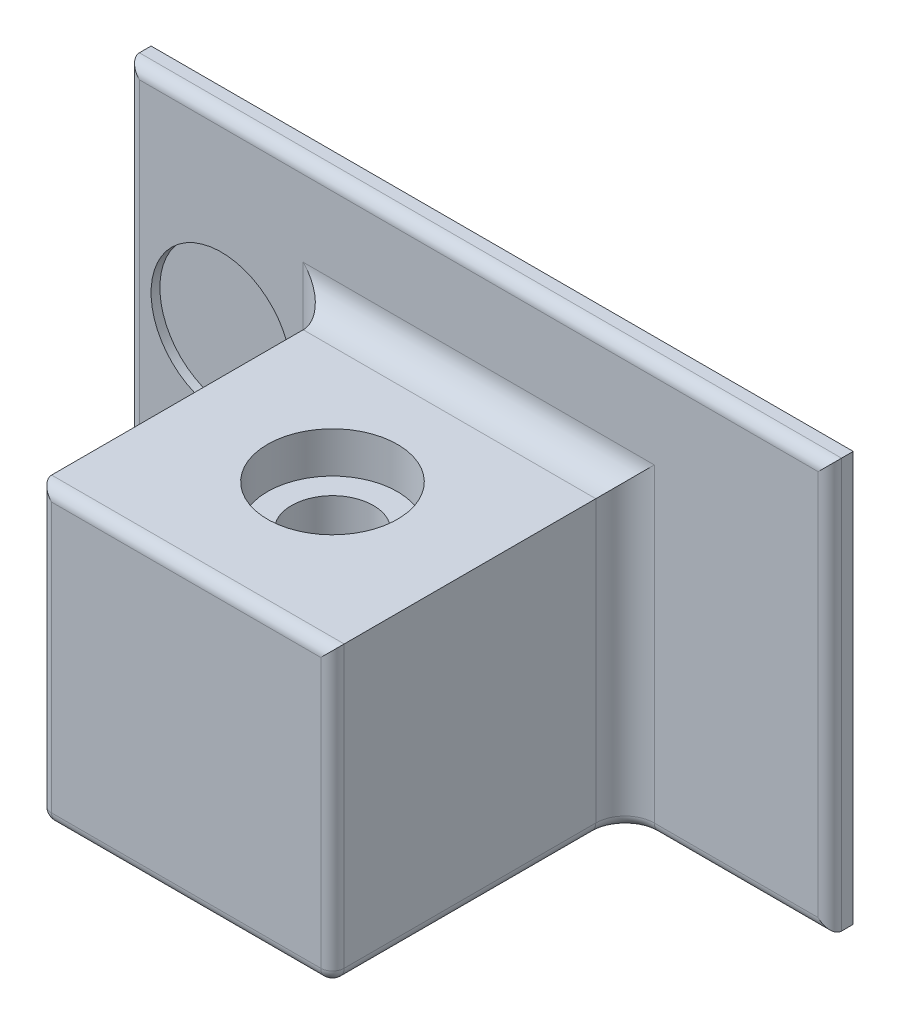
ISO-10303-21;
HEADER;
FILE_DESCRIPTION(('STEP AP214'),'2;1');
FILE_NAME('part.step','',(''),(''),'','','');
FILE_SCHEMA(('AUTOMOTIVE_DESIGN { 1 0 10303 214 1 1 1 1 }'));
ENDSEC;
DATA;
#1=APPLICATION_CONTEXT('core data for automotive mechanical design processes');
#2=APPLICATION_PROTOCOL_DEFINITION('international standard','automotive_design',2000,#1);
#3=PRODUCT_CONTEXT('',#1,'mechanical');
#4=PRODUCT('Part','Part','',(#3));
#5=PRODUCT_RELATED_PRODUCT_CATEGORY('part','',(#4));
#6=PRODUCT_DEFINITION_FORMATION('','',#4);
#7=PRODUCT_DEFINITION_CONTEXT('part definition',#1,'design');
#8=PRODUCT_DEFINITION('design','',#6,#7);
#9=PRODUCT_DEFINITION_SHAPE('','',#8);
#10=(LENGTH_UNIT() NAMED_UNIT(*) SI_UNIT(.MILLI.,.METRE.));
#11=(NAMED_UNIT(*) PLANE_ANGLE_UNIT() SI_UNIT($,.RADIAN.));
#12=(NAMED_UNIT(*) SI_UNIT($,.STERADIAN.) SOLID_ANGLE_UNIT());
#13=UNCERTAINTY_MEASURE_WITH_UNIT(LENGTH_MEASURE(1.E-05),#10,'distance_accuracy_value','');
#14=(GEOMETRIC_REPRESENTATION_CONTEXT(3) GLOBAL_UNCERTAINTY_ASSIGNED_CONTEXT((#13)) GLOBAL_UNIT_ASSIGNED_CONTEXT((#10,
#11,#12)) REPRESENTATION_CONTEXT('',''));
#15=CARTESIAN_POINT('',(0.,0.,0.));
#16=DIRECTION('',(0.,0.,1.));
#17=DIRECTION('',(1.,0.,0.));
#18=AXIS2_PLACEMENT_3D('',#15,#16,#17);
#19=CARTESIAN_POINT('',(0.,35.,29.));
#20=DIRECTION('',(0.,-1.,0.));
#21=DIRECTION('',(1.,0.,0.));
#22=AXIS2_PLACEMENT_3D('',#19,#20,#21);
#23=CYLINDRICAL_SURFACE('',#22,7.);
#24=CARTESIAN_POINT('',(0.,-28.,29.));
#25=DIRECTION('',(0.,-1.,0.));
#26=DIRECTION('',(1.,0.,0.));
#27=AXIS2_PLACEMENT_3D('',#24,#25,#26);
#28=CIRCLE('',#27,7.);
#29=CARTESIAN_POINT('',(7.,-28.,29.));
#30=VERTEX_POINT('',#29);
#31=EDGE_CURVE('E204',#30,#30,#28,.T.);
#32=ORIENTED_EDGE('',*,*,#31,.T.);
#33=EDGE_LOOP('',(#32));
#34=FACE_BOUND('',#33,.T.);
#35=CARTESIAN_POINT('',(0.,8.,29.));
#36=DIRECTION('',(0.,1.,0.));
#37=DIRECTION('',(-1.,0.,0.));
#38=AXIS2_PLACEMENT_3D('',#35,#36,#37);
#39=CIRCLE('',#38,7.);
#40=CARTESIAN_POINT('',(-7.,8.,29.));
#41=VERTEX_POINT('',#40);
#42=EDGE_CURVE('E196',#41,#41,#39,.F.);
#43=ORIENTED_EDGE('',*,*,#42,.F.);
#44=EDGE_LOOP('',(#43));
#45=FACE_BOUND('',#44,.T.);
#46=ADVANCED_FACE('F41',(#34,#45),#23,.F.);
#47=CARTESIAN_POINT('',(-60.,35.,4.));
#48=DIRECTION('',(0.,-1.,0.));
#49=DIRECTION('',(1.,0.,0.));
#50=AXIS2_PLACEMENT_3D('',#47,#48,#49);
#51=PLANE('',#50);
#52=DIRECTION('',(0.,0.,-1.));
#53=VECTOR('',#52,1.);
#54=CARTESIAN_POINT('',(-60.,35.,4.));
#55=LINE('',#54,#53);
#56=CARTESIAN_POINT('',(-60.,35.,2.));
#57=VERTEX_POINT('',#56);
#58=CARTESIAN_POINT('',(-60.,35.,0.));
#59=VERTEX_POINT('',#58);
#60=EDGE_CURVE('E156',#57,#59,#55,.T.);
#61=ORIENTED_EDGE('',*,*,#60,.F.);
#62=DIRECTION('',(-1.,0.,0.));
#63=VECTOR('',#62,1.);
#64=CARTESIAN_POINT('',(60.,35.,2.));
#65=LINE('',#64,#63);
#66=CARTESIAN_POINT('',(60.,35.,2.));
#67=VERTEX_POINT('',#66);
#68=EDGE_CURVE('E264',#57,#67,#65,.F.);
#69=ORIENTED_EDGE('',*,*,#68,.T.);
#70=DIRECTION('',(0.,0.,-1.));
#71=VECTOR('',#70,1.);
#72=CARTESIAN_POINT('',(60.,35.,4.));
#73=LINE('',#72,#71);
#74=CARTESIAN_POINT('',(60.,35.,0.));
#75=VERTEX_POINT('',#74);
#76=EDGE_CURVE('E183',#67,#75,#73,.T.);
#77=ORIENTED_EDGE('',*,*,#76,.T.);
#78=DIRECTION('',(-1.,0.,0.));
#79=VECTOR('',#78,1.);
#80=CARTESIAN_POINT('',(-60.,35.,0.));
#81=LINE('',#80,#79);
#82=EDGE_CURVE('E178',#75,#59,#81,.T.);
#83=ORIENTED_EDGE('',*,*,#82,.T.);
#84=EDGE_LOOP('',(#61,#69,#77,#83));
#85=FACE_BOUND('',#84,.T.);
#86=ADVANCED_FACE('F185',(#85),#51,.F.);
#87=CARTESIAN_POINT('',(-60.,-35.,4.));
#88=DIRECTION('',(1.,0.,0.));
#89=DIRECTION('',(0.,0.,-1.));
#90=AXIS2_PLACEMENT_3D('',#87,#88,#89);
#91=PLANE('',#90);
#92=DIRECTION('',(0.,0.,-1.));
#93=VECTOR('',#92,1.);
#94=CARTESIAN_POINT('',(-60.,-35.,4.));
#95=LINE('',#94,#93);
#96=CARTESIAN_POINT('',(-60.,-35.,2.));
#97=VERTEX_POINT('',#96);
#98=CARTESIAN_POINT('',(-60.,-35.,0.));
#99=VERTEX_POINT('',#98);
#100=EDGE_CURVE('E175',#97,#99,#95,.T.);
#101=ORIENTED_EDGE('',*,*,#100,.F.);
#102=DIRECTION('',(0.,-1.,0.));
#103=VECTOR('',#102,1.);
#104=CARTESIAN_POINT('',(-60.,35.,2.));
#105=LINE('',#104,#103);
#106=EDGE_CURVE('E170',#97,#57,#105,.F.);
#107=ORIENTED_EDGE('',*,*,#106,.T.);
#108=ORIENTED_EDGE('',*,*,#60,.T.);
#109=DIRECTION('',(0.,-1.,0.));
#110=VECTOR('',#109,1.);
#111=CARTESIAN_POINT('',(-60.,-35.,0.));
#112=LINE('',#111,#110);
#113=EDGE_CURVE('E165',#59,#99,#112,.T.);
#114=ORIENTED_EDGE('',*,*,#113,.T.);
#115=EDGE_LOOP('',(#101,#107,#108,#114));
#116=FACE_BOUND('',#115,.T.);
#117=ADVANCED_FACE('F161',(#116),#91,.F.);
#118=CARTESIAN_POINT('',(-60.,-35.,4.));
#119=DIRECTION('',(0.,1.,0.));
#120=DIRECTION('',(-1.,0.,0.));
#121=AXIS2_PLACEMENT_3D('',#118,#119,#120);
#122=PLANE('',#121);
#123=DIRECTION('',(0.,0.,-1.));
#124=VECTOR('',#123,1.);
#125=CARTESIAN_POINT('',(60.,-35.,4.));
#126=LINE('',#125,#124);
#127=CARTESIAN_POINT('',(60.,-35.,2.));
#128=VERTEX_POINT('',#127);
#129=CARTESIAN_POINT('',(60.,-35.,0.));
#130=VERTEX_POINT('',#129);
#131=EDGE_CURVE('E197',#128,#130,#126,.T.);
#132=ORIENTED_EDGE('',*,*,#131,.F.);
#133=DIRECTION('',(1.,0.,0.));
#134=VECTOR('',#133,1.);
#135=CARTESIAN_POINT('',(30.,-35.,2.));
#136=LINE('',#135,#134);
#137=CARTESIAN_POINT('',(30.,-35.,2.));
#138=VERTEX_POINT('',#137);
#139=EDGE_CURVE('E242',#128,#138,#136,.F.);
#140=ORIENTED_EDGE('',*,*,#139,.T.);
#141=CARTESIAN_POINT('',(30.,-35.,9.));
#142=DIRECTION('',(0.,1.,0.));
#143=DIRECTION('',(-1.,0.,0.));
#144=AXIS2_PLACEMENT_3D('',#141,#142,#143);
#145=CIRCLE('',#144,7.);
#146=CARTESIAN_POINT('',(23.,-35.,9.));
#147=VERTEX_POINT('',#146);
#148=EDGE_CURVE('E245',#138,#147,#145,.T.);
#149=ORIENTED_EDGE('',*,*,#148,.T.);
#150=DIRECTION('',(0.,0.,-1.));
#151=VECTOR('',#150,1.);
#152=CARTESIAN_POINT('',(23.,-35.,4.));
#153=LINE('',#152,#151);
#154=CARTESIAN_POINT('',(23.,-35.,52.));
#155=VERTEX_POINT('',#154);
#156=EDGE_CURVE('E237',#147,#155,#153,.F.);
#157=ORIENTED_EDGE('',*,*,#156,.T.);
#158=DIRECTION('',(1.,0.,0.));
#159=VECTOR('',#158,1.);
#160=CARTESIAN_POINT('',(-25.,-35.,52.));
#161=LINE('',#160,#159);
#162=CARTESIAN_POINT('',(-23.,-35.,52.));
#163=VERTEX_POINT('',#162);
#164=EDGE_CURVE('E233',#155,#163,#161,.F.);
#165=ORIENTED_EDGE('',*,*,#164,.T.);
#166=DIRECTION('',(0.,0.,-1.));
#167=VECTOR('',#166,1.);
#168=CARTESIAN_POINT('',(-23.,-35.,4.));
#169=LINE('',#168,#167);
#170=CARTESIAN_POINT('',(-23.,-35.,9.));
#171=VERTEX_POINT('',#170);
#172=EDGE_CURVE('E231',#163,#171,#169,.T.);
#173=ORIENTED_EDGE('',*,*,#172,.T.);
#174=CARTESIAN_POINT('',(-30.,-35.,9.));
#175=DIRECTION('',(0.,1.,0.));
#176=DIRECTION('',(-1.,0.,0.));
#177=AXIS2_PLACEMENT_3D('',#174,#175,#176);
#178=CIRCLE('',#177,7.);
#179=CARTESIAN_POINT('',(-30.,-35.,2.));
#180=VERTEX_POINT('',#179);
#181=EDGE_CURVE('E232',#171,#180,#178,.T.);
#182=ORIENTED_EDGE('',*,*,#181,.T.);
#183=DIRECTION('',(1.,0.,0.));
#184=VECTOR('',#183,1.);
#185=CARTESIAN_POINT('',(-60.,-35.,2.));
#186=LINE('',#185,#184);
#187=EDGE_CURVE('E240',#180,#97,#186,.F.);
#188=ORIENTED_EDGE('',*,*,#187,.T.);
#189=ORIENTED_EDGE('',*,*,#100,.T.);
#190=DIRECTION('',(1.,0.,0.));
#191=VECTOR('',#190,1.);
#192=CARTESIAN_POINT('',(-60.,-35.,0.));
#193=LINE('',#192,#191);
#194=EDGE_CURVE('E179',#99,#130,#193,.T.);
#195=ORIENTED_EDGE('',*,*,#194,.T.);
#196=EDGE_LOOP('',(#132,#140,#149,#157,#165,#173,#182,#188,#189,#195));
#197=FACE_BOUND('',#196,.T.);
#198=CARTESIAN_POINT('',(0.,-35.,29.));
#199=DIRECTION('',(0.,-1.,0.));
#200=DIRECTION('',(1.,0.,0.));
#201=AXIS2_PLACEMENT_3D('',#198,#199,#200);
#202=CIRCLE('',#201,11.1);
#203=CARTESIAN_POINT('',(11.1,-35.,29.));
#204=VERTEX_POINT('',#203);
#205=EDGE_CURVE('E375',#204,#204,#202,.T.);
#206=ORIENTED_EDGE('',*,*,#205,.F.);
#207=EDGE_LOOP('',(#206));
#208=FACE_BOUND('',#207,.T.);
#209=ADVANCED_FACE('F326',(#197,#208),#122,.F.);
#210=CARTESIAN_POINT('',(60.,-35.,4.));
#211=DIRECTION('',(-1.,0.,0.));
#212=DIRECTION('',(0.,0.,1.));
#213=AXIS2_PLACEMENT_3D('',#210,#211,#212);
#214=PLANE('',#213);
#215=ORIENTED_EDGE('',*,*,#76,.F.);
#216=DIRECTION('',(0.,1.,0.));
#217=VECTOR('',#216,1.);
#218=CARTESIAN_POINT('',(60.,-35.,2.));
#219=LINE('',#218,#217);
#220=EDGE_CURVE('E258',#67,#128,#219,.F.);
#221=ORIENTED_EDGE('',*,*,#220,.T.);
#222=ORIENTED_EDGE('',*,*,#131,.T.);
#223=DIRECTION('',(0.,1.,0.));
#224=VECTOR('',#223,1.);
#225=CARTESIAN_POINT('',(60.,-35.,0.));
#226=LINE('',#225,#224);
#227=EDGE_CURVE('E194',#130,#75,#226,.T.);
#228=ORIENTED_EDGE('',*,*,#227,.T.);
#229=EDGE_LOOP('',(#215,#221,#222,#228));
#230=FACE_BOUND('',#229,.T.);
#231=ADVANCED_FACE('F402',(#230),#214,.F.);
#232=CARTESIAN_POINT('',(0.,0.,4.));
#233=DIRECTION('',(0.,0.,1.));
#234=DIRECTION('',(1.,0.,0.));
#235=AXIS2_PLACEMENT_3D('',#232,#233,#234);
#236=PLANE('',#235);
#237=DIRECTION('',(0.,1.,0.));
#238=VECTOR('',#237,1.);
#239=CARTESIAN_POINT('',(30.,0.,4.));
#240=LINE('',#239,#238);
#241=CARTESIAN_POINT('',(30.,20.,4.));
#242=VERTEX_POINT('',#241);
#243=CARTESIAN_POINT('',(30.,-33.,4.));
#244=VERTEX_POINT('',#243);
#245=EDGE_CURVE('E208',#242,#244,#240,.F.);
#246=ORIENTED_EDGE('',*,*,#245,.T.);
#247=DIRECTION('',(1.,0.,0.));
#248=VECTOR('',#247,1.);
#249=CARTESIAN_POINT('',(60.,-33.,4.));
#250=LINE('',#249,#248);
#251=CARTESIAN_POINT('',(58.,-33.,4.));
#252=VERTEX_POINT('',#251);
#253=EDGE_CURVE('E257',#244,#252,#250,.T.);
#254=ORIENTED_EDGE('',*,*,#253,.T.);
#255=DIRECTION('',(0.,1.,0.));
#256=VECTOR('',#255,1.);
#257=CARTESIAN_POINT('',(58.,35.,4.));
#258=LINE('',#257,#256);
#259=CARTESIAN_POINT('',(58.,33.,4.));
#260=VERTEX_POINT('',#259);
#261=EDGE_CURVE('E255',#252,#260,#258,.T.);
#262=ORIENTED_EDGE('',*,*,#261,.T.);
#263=DIRECTION('',(-1.,0.,0.));
#264=VECTOR('',#263,1.);
#265=CARTESIAN_POINT('',(-60.,33.,4.));
#266=LINE('',#265,#264);
#267=CARTESIAN_POINT('',(-58.,33.,4.));
#268=VERTEX_POINT('',#267);
#269=EDGE_CURVE('E249',#260,#268,#266,.T.);
#270=ORIENTED_EDGE('',*,*,#269,.T.);
#271=DIRECTION('',(0.,-1.,0.));
#272=VECTOR('',#271,1.);
#273=CARTESIAN_POINT('',(-58.,-35.,4.));
#274=LINE('',#273,#272);
#275=CARTESIAN_POINT('',(-58.,-33.,4.));
#276=VERTEX_POINT('',#275);
#277=EDGE_CURVE('E247',#268,#276,#274,.T.);
#278=ORIENTED_EDGE('',*,*,#277,.T.);
#279=DIRECTION('',(1.,0.,0.));
#280=VECTOR('',#279,1.);
#281=CARTESIAN_POINT('',(-30.,-33.,4.));
#282=LINE('',#281,#280);
#283=CARTESIAN_POINT('',(-30.,-33.,4.));
#284=VERTEX_POINT('',#283);
#285=EDGE_CURVE('E251',#276,#284,#282,.T.);
#286=ORIENTED_EDGE('',*,*,#285,.T.);
#287=DIRECTION('',(0.,-1.,0.));
#288=VECTOR('',#287,1.);
#289=CARTESIAN_POINT('',(-30.,0.,4.));
#290=LINE('',#289,#288);
#291=CARTESIAN_POINT('',(-30.,20.,4.));
#292=VERTEX_POINT('',#291);
#293=EDGE_CURVE('E207',#284,#292,#290,.F.);
#294=ORIENTED_EDGE('',*,*,#293,.T.);
#295=DIRECTION('',(-1.,0.,0.));
#296=VECTOR('',#295,1.);
#297=CARTESIAN_POINT('',(0.,20.,4.));
#298=LINE('',#297,#296);
#299=EDGE_CURVE('E206',#292,#242,#298,.F.);
#300=ORIENTED_EDGE('',*,*,#299,.T.);
#301=EDGE_LOOP('',(#246,#254,#262,#270,#278,#286,#294,#300));
#302=FACE_BOUND('',#301,.T.);
#303=CARTESIAN_POINT('',(-44.,2.5,4.));
#304=DIRECTION('',(0.,0.,1.));
#305=DIRECTION('',(1.,0.,0.));
#306=AXIS2_PLACEMENT_3D('',#303,#304,#305);
#307=CIRCLE('',#306,12.);
#308=CARTESIAN_POINT('',(-32.,2.5,4.));
#309=VERTEX_POINT('',#308);
#310=EDGE_CURVE('E228',#309,#309,#307,.T.);
#311=ORIENTED_EDGE('',*,*,#310,.F.);
#312=EDGE_LOOP('',(#311));
#313=FACE_BOUND('',#312,.T.);
#314=ADVANCED_FACE('F400',(#302,#313),#236,.T.);
#315=CARTESIAN_POINT('',(0.,0.,0.));
#316=DIRECTION('',(0.,0.,1.));
#317=DIRECTION('',(1.,0.,0.));
#318=AXIS2_PLACEMENT_3D('',#315,#316,#317);
#319=PLANE('',#318);
#320=ORIENTED_EDGE('',*,*,#82,.F.);
#321=ORIENTED_EDGE('',*,*,#227,.F.);
#322=ORIENTED_EDGE('',*,*,#194,.F.);
#323=ORIENTED_EDGE('',*,*,#113,.F.);
#324=EDGE_LOOP('',(#320,#321,#322,#323));
#325=FACE_BOUND('',#324,.T.);
#326=ADVANCED_FACE('F176',(#325),#319,.F.);
#327=CARTESIAN_POINT('',(25.,15.,54.));
#328=DIRECTION('',(-1.,0.,0.));
#329=DIRECTION('',(0.,-1.,0.));
#330=AXIS2_PLACEMENT_3D('',#327,#328,#329);
#331=PLANE('',#330);
#332=DIRECTION('',(0.,1.,0.));
#333=VECTOR('',#332,1.);
#334=CARTESIAN_POINT('',(25.,-35.,52.));
#335=LINE('',#334,#333);
#336=CARTESIAN_POINT('',(25.,15.,52.));
#337=VERTEX_POINT('',#336);
#338=CARTESIAN_POINT('',(25.,-33.,52.));
#339=VERTEX_POINT('',#338);
#340=EDGE_CURVE('E216',#337,#339,#335,.F.);
#341=ORIENTED_EDGE('',*,*,#340,.T.);
#342=DIRECTION('',(0.,0.,-1.));
#343=VECTOR('',#342,1.);
#344=CARTESIAN_POINT('',(25.,-33.,54.));
#345=LINE('',#344,#343);
#346=CARTESIAN_POINT('',(25.,-33.,9.));
#347=VERTEX_POINT('',#346);
#348=EDGE_CURVE('E226',#339,#347,#345,.T.);
#349=ORIENTED_EDGE('',*,*,#348,.T.);
#350=DIRECTION('',(0.,1.,0.));
#351=VECTOR('',#350,1.);
#352=CARTESIAN_POINT('',(25.,15.,9.));
#353=LINE('',#352,#351);
#354=CARTESIAN_POINT('',(25.,15.,9.));
#355=VERTEX_POINT('',#354);
#356=EDGE_CURVE('E171',#347,#355,#353,.T.);
#357=ORIENTED_EDGE('',*,*,#356,.T.);
#358=DIRECTION('',(0.,0.,-1.));
#359=VECTOR('',#358,1.);
#360=CARTESIAN_POINT('',(25.,15.,54.));
#361=LINE('',#360,#359);
#362=EDGE_CURVE('E187',#337,#355,#361,.T.);
#363=ORIENTED_EDGE('',*,*,#362,.F.);
#364=EDGE_LOOP('',(#341,#349,#357,#363));
#365=FACE_BOUND('',#364,.T.);
#366=ADVANCED_FACE('F406',(#365),#331,.F.);
#367=CARTESIAN_POINT('',(-25.,15.,54.));
#368=DIRECTION('',(0.,-1.,0.));
#369=DIRECTION('',(0.,0.,-1.));
#370=AXIS2_PLACEMENT_3D('',#367,#368,#369);
#371=PLANE('',#370);
#372=CARTESIAN_POINT('',(0.,15.,29.));
#373=DIRECTION('',(0.,1.,0.));
#374=DIRECTION('',(-1.,0.,0.));
#375=AXIS2_PLACEMENT_3D('',#372,#373,#374);
#376=CIRCLE('',#375,11.1);
#377=CARTESIAN_POINT('',(-11.1,15.,29.));
#378=VERTEX_POINT('',#377);
#379=EDGE_CURVE('E378',#378,#378,#376,.T.);
#380=ORIENTED_EDGE('',*,*,#379,.F.);
#381=EDGE_LOOP('',(#380));
#382=FACE_BOUND('',#381,.T.);
#383=DIRECTION('',(0.,0.,-1.));
#384=VECTOR('',#383,1.);
#385=CARTESIAN_POINT('',(-25.,15.,54.));
#386=LINE('',#385,#384);
#387=CARTESIAN_POINT('',(-25.,15.,52.));
#388=VERTEX_POINT('',#387);
#389=CARTESIAN_POINT('',(-25.,15.,9.));
#390=VERTEX_POINT('',#389);
#391=EDGE_CURVE('E189',#388,#390,#386,.T.);
#392=ORIENTED_EDGE('',*,*,#391,.F.);
#393=DIRECTION('',(-1.,0.,0.));
#394=VECTOR('',#393,1.);
#395=CARTESIAN_POINT('',(25.,15.,52.));
#396=LINE('',#395,#394);
#397=EDGE_CURVE('E11',#388,#337,#396,.F.);
#398=ORIENTED_EDGE('',*,*,#397,.T.);
#399=ORIENTED_EDGE('',*,*,#362,.T.);
#400=DIRECTION('',(-1.,0.,0.));
#401=VECTOR('',#400,1.);
#402=CARTESIAN_POINT('',(-25.,15.,9.));
#403=LINE('',#402,#401);
#404=EDGE_CURVE('E214',#355,#390,#403,.T.);
#405=ORIENTED_EDGE('',*,*,#404,.T.);
#406=EDGE_LOOP('',(#392,#398,#399,#405));
#407=FACE_BOUND('',#406,.T.);
#408=ADVANCED_FACE('F366',(#382,#407),#371,.F.);
#409=CARTESIAN_POINT('',(-25.,15.,54.));
#410=DIRECTION('',(1.,0.,0.));
#411=DIRECTION('',(0.,1.,0.));
#412=AXIS2_PLACEMENT_3D('',#409,#410,#411);
#413=PLANE('',#412);
#414=DIRECTION('',(0.,-1.,0.));
#415=VECTOR('',#414,1.);
#416=CARTESIAN_POINT('',(-25.,15.,9.));
#417=LINE('',#416,#415);
#418=CARTESIAN_POINT('',(-25.,-33.,9.));
#419=VERTEX_POINT('',#418);
#420=EDGE_CURVE('E217',#390,#419,#417,.T.);
#421=ORIENTED_EDGE('',*,*,#420,.T.);
#422=DIRECTION('',(0.,0.,-1.));
#423=VECTOR('',#422,1.);
#424=CARTESIAN_POINT('',(-25.,-33.,54.));
#425=LINE('',#424,#423);
#426=CARTESIAN_POINT('',(-25.,-33.,52.));
#427=VERTEX_POINT('',#426);
#428=EDGE_CURVE('E269',#419,#427,#425,.F.);
#429=ORIENTED_EDGE('',*,*,#428,.T.);
#430=DIRECTION('',(0.,-1.,0.));
#431=VECTOR('',#430,1.);
#432=CARTESIAN_POINT('',(-25.,15.,52.));
#433=LINE('',#432,#431);
#434=EDGE_CURVE('E263',#427,#388,#433,.F.);
#435=ORIENTED_EDGE('',*,*,#434,.T.);
#436=ORIENTED_EDGE('',*,*,#391,.T.);
#437=EDGE_LOOP('',(#421,#429,#435,#436));
#438=FACE_BOUND('',#437,.T.);
#439=ADVANCED_FACE('F364',(#438),#413,.F.);
#440=CARTESIAN_POINT('',(0.,0.,54.));
#441=DIRECTION('',(0.,0.,1.));
#442=DIRECTION('',(1.,0.,0.));
#443=AXIS2_PLACEMENT_3D('',#440,#441,#442);
#444=PLANE('',#443);
#445=DIRECTION('',(0.,1.,0.));
#446=VECTOR('',#445,1.);
#447=CARTESIAN_POINT('',(23.,15.,54.));
#448=LINE('',#447,#446);
#449=CARTESIAN_POINT('',(23.,-33.,54.));
#450=VERTEX_POINT('',#449);
#451=CARTESIAN_POINT('',(23.,13.,54.));
#452=VERTEX_POINT('',#451);
#453=EDGE_CURVE('E59',#450,#452,#448,.T.);
#454=ORIENTED_EDGE('',*,*,#453,.T.);
#455=DIRECTION('',(-1.,0.,0.));
#456=VECTOR('',#455,1.);
#457=CARTESIAN_POINT('',(-25.,13.,54.));
#458=LINE('',#457,#456);
#459=CARTESIAN_POINT('',(-23.,13.,54.));
#460=VERTEX_POINT('',#459);
#461=EDGE_CURVE('E49',#452,#460,#458,.T.);
#462=ORIENTED_EDGE('',*,*,#461,.T.);
#463=DIRECTION('',(0.,-1.,0.));
#464=VECTOR('',#463,1.);
#465=CARTESIAN_POINT('',(-23.,-35.,54.));
#466=LINE('',#465,#464);
#467=CARTESIAN_POINT('',(-23.,-33.,54.));
#468=VERTEX_POINT('',#467);
#469=EDGE_CURVE('E270',#460,#468,#466,.T.);
#470=ORIENTED_EDGE('',*,*,#469,.T.);
#471=DIRECTION('',(1.,0.,0.));
#472=VECTOR('',#471,1.);
#473=CARTESIAN_POINT('',(25.,-33.,54.));
#474=LINE('',#473,#472);
#475=EDGE_CURVE('E64',#468,#450,#474,.T.);
#476=ORIENTED_EDGE('',*,*,#475,.T.);
#477=EDGE_LOOP('',(#454,#462,#470,#476));
#478=FACE_BOUND('',#477,.T.);
#479=ADVANCED_FACE('F356',(#478),#444,.T.);
#480=CARTESIAN_POINT('',(0.,-28.,29.));
#481=DIRECTION('',(0.,-1.,0.));
#482=DIRECTION('',(1.,0.,0.));
#483=AXIS2_PLACEMENT_3D('',#480,#481,#482);
#484=CYLINDRICAL_SURFACE('',#483,11.1);
#485=CARTESIAN_POINT('',(0.,-28.,29.));
#486=DIRECTION('',(0.,-1.,0.));
#487=DIRECTION('',(1.,0.,0.));
#488=AXIS2_PLACEMENT_3D('',#485,#486,#487);
#489=CIRCLE('',#488,11.1);
#490=CARTESIAN_POINT('',(11.1,-28.,29.));
#491=VERTEX_POINT('',#490);
#492=EDGE_CURVE('E369',#491,#491,#489,.T.);
#493=ORIENTED_EDGE('',*,*,#492,.F.);
#494=EDGE_LOOP('',(#493));
#495=FACE_BOUND('',#494,.T.);
#496=ORIENTED_EDGE('',*,*,#205,.T.);
#497=EDGE_LOOP('',(#496));
#498=FACE_BOUND('',#497,.T.);
#499=ADVANCED_FACE('F427',(#495,#498),#484,.F.);
#500=CARTESIAN_POINT('',(0.,-28.,29.));
#501=DIRECTION('',(0.,-1.,0.));
#502=DIRECTION('',(1.,0.,0.));
#503=AXIS2_PLACEMENT_3D('',#500,#501,#502);
#504=PLANE('',#503);
#505=ORIENTED_EDGE('',*,*,#31,.F.);
#506=EDGE_LOOP('',(#505));
#507=FACE_BOUND('',#506,.T.);
#508=ORIENTED_EDGE('',*,*,#492,.T.);
#509=EDGE_LOOP('',(#508));
#510=FACE_BOUND('',#509,.T.);
#511=ADVANCED_FACE('F430',(#507,#510),#504,.T.);
#512=CARTESIAN_POINT('',(0.,8.,29.));
#513=DIRECTION('',(0.,1.,0.));
#514=DIRECTION('',(-1.,0.,0.));
#515=AXIS2_PLACEMENT_3D('',#512,#513,#514);
#516=PLANE('',#515);
#517=CARTESIAN_POINT('',(0.,8.,29.));
#518=DIRECTION('',(0.,1.,0.));
#519=DIRECTION('',(-1.,0.,0.));
#520=AXIS2_PLACEMENT_3D('',#517,#518,#519);
#521=CIRCLE('',#520,11.1);
#522=CARTESIAN_POINT('',(-11.1,8.,29.));
#523=VERTEX_POINT('',#522);
#524=EDGE_CURVE('E202',#523,#523,#521,.T.);
#525=ORIENTED_EDGE('',*,*,#524,.T.);
#526=EDGE_LOOP('',(#525));
#527=FACE_BOUND('',#526,.T.);
#528=ORIENTED_EDGE('',*,*,#42,.T.);
#529=EDGE_LOOP('',(#528));
#530=FACE_BOUND('',#529,.T.);
#531=ADVANCED_FACE('F429',(#527,#530),#516,.T.);
#532=CARTESIAN_POINT('',(0.,8.,29.));
#533=DIRECTION('',(0.,1.,0.));
#534=DIRECTION('',(-1.,0.,0.));
#535=AXIS2_PLACEMENT_3D('',#532,#533,#534);
#536=CYLINDRICAL_SURFACE('',#535,11.1);
#537=ORIENTED_EDGE('',*,*,#524,.F.);
#538=EDGE_LOOP('',(#537));
#539=FACE_BOUND('',#538,.T.);
#540=ORIENTED_EDGE('',*,*,#379,.T.);
#541=EDGE_LOOP('',(#540));
#542=FACE_BOUND('',#541,.T.);
#543=ADVANCED_FACE('F393',(#539,#542),#536,.F.);
#544=CARTESIAN_POINT('',(-44.,2.5,2.5));
#545=DIRECTION('',(0.,0.,1.));
#546=DIRECTION('',(1.,0.,0.));
#547=AXIS2_PLACEMENT_3D('',#544,#545,#546);
#548=CYLINDRICAL_SURFACE('',#547,12.);
#549=CARTESIAN_POINT('',(-44.,2.5,2.5));
#550=DIRECTION('',(0.,0.,1.));
#551=DIRECTION('',(1.,0.,0.));
#552=AXIS2_PLACEMENT_3D('',#549,#550,#551);
#553=CIRCLE('',#552,12.);
#554=CARTESIAN_POINT('',(-32.,2.5,2.5));
#555=VERTEX_POINT('',#554);
#556=EDGE_CURVE('E385',#555,#555,#553,.T.);
#557=ORIENTED_EDGE('',*,*,#556,.F.);
#558=EDGE_LOOP('',(#557));
#559=FACE_BOUND('',#558,.T.);
#560=ORIENTED_EDGE('',*,*,#310,.T.);
#561=EDGE_LOOP('',(#560));
#562=FACE_BOUND('',#561,.T.);
#563=ADVANCED_FACE('F394',(#559,#562),#548,.F.);
#564=CARTESIAN_POINT('',(-44.,2.5,2.5));
#565=DIRECTION('',(0.,0.,1.));
#566=DIRECTION('',(1.,0.,0.));
#567=AXIS2_PLACEMENT_3D('',#564,#565,#566);
#568=PLANE('',#567);
#569=ORIENTED_EDGE('',*,*,#556,.T.);
#570=EDGE_LOOP('',(#569));
#571=FACE_BOUND('',#570,.T.);
#572=ADVANCED_FACE('F388',(#571),#568,.T.);
#573=CARTESIAN_POINT('',(-30.,15.,9.));
#574=DIRECTION('',(0.,-1.,0.));
#575=DIRECTION('',(1.,0.,0.));
#576=AXIS2_PLACEMENT_3D('',#573,#574,#575);
#577=CYLINDRICAL_SURFACE('',#576,5.);
#578=ORIENTED_EDGE('',*,*,#293,.F.);
#579=CARTESIAN_POINT('',(-30.,-33.,9.));
#580=DIRECTION('',(0.,1.,0.));
#581=DIRECTION('',(-1.,0.,0.));
#582=AXIS2_PLACEMENT_3D('',#579,#580,#581);
#583=CIRCLE('',#582,5.);
#584=EDGE_CURVE('E259',#284,#419,#583,.F.);
#585=ORIENTED_EDGE('',*,*,#584,.T.);
#586=ORIENTED_EDGE('',*,*,#420,.F.);
#587=CARTESIAN_POINT('',(-30.,20.,9.));
#588=DIRECTION('',(-0.707106781186547,-0.707106781186548,0.));
#589=DIRECTION('',(0.707106781186548,-0.707106781186547,0.));
#590=AXIS2_PLACEMENT_3D('',#587,#588,#589);
#591=ELLIPSE('',#590,7.07106781186548,5.);
#592=EDGE_CURVE('E222',#292,#390,#591,.T.);
#593=ORIENTED_EDGE('',*,*,#592,.F.);
#594=EDGE_LOOP('',(#578,#585,#586,#593));
#595=FACE_BOUND('',#594,.T.);
#596=ADVANCED_FACE('F453',(#595),#577,.F.);
#597=CARTESIAN_POINT('',(-25.,20.,9.));
#598=DIRECTION('',(-1.,0.,0.));
#599=DIRECTION('',(0.,0.,1.));
#600=AXIS2_PLACEMENT_3D('',#597,#598,#599);
#601=CYLINDRICAL_SURFACE('',#600,5.);
#602=ORIENTED_EDGE('',*,*,#592,.T.);
#603=ORIENTED_EDGE('',*,*,#404,.F.);
#604=CARTESIAN_POINT('',(30.,20.,9.));
#605=DIRECTION('',(-0.707106781186547,0.707106781186547,0.));
#606=DIRECTION('',(-0.707106781186547,-0.707106781186548,0.));
#607=AXIS2_PLACEMENT_3D('',#604,#605,#606);
#608=ELLIPSE('',#607,7.07106781186547,5.);
#609=EDGE_CURVE('E218',#242,#355,#608,.T.);
#610=ORIENTED_EDGE('',*,*,#609,.F.);
#611=ORIENTED_EDGE('',*,*,#299,.F.);
#612=EDGE_LOOP('',(#602,#603,#610,#611));
#613=FACE_BOUND('',#612,.T.);
#614=ADVANCED_FACE('F452',(#613),#601,.F.);
#615=CARTESIAN_POINT('',(30.,15.,9.));
#616=DIRECTION('',(0.,1.,0.));
#617=DIRECTION('',(-1.,0.,0.));
#618=AXIS2_PLACEMENT_3D('',#615,#616,#617);
#619=CYLINDRICAL_SURFACE('',#618,5.);
#620=ORIENTED_EDGE('',*,*,#356,.F.);
#621=CARTESIAN_POINT('',(30.,-33.,9.));
#622=DIRECTION('',(0.,1.,0.));
#623=DIRECTION('',(-1.,0.,0.));
#624=AXIS2_PLACEMENT_3D('',#621,#622,#623);
#625=CIRCLE('',#624,5.);
#626=EDGE_CURVE('E246',#347,#244,#625,.F.);
#627=ORIENTED_EDGE('',*,*,#626,.T.);
#628=ORIENTED_EDGE('',*,*,#245,.F.);
#629=ORIENTED_EDGE('',*,*,#609,.T.);
#630=EDGE_LOOP('',(#620,#627,#628,#629));
#631=FACE_BOUND('',#630,.T.);
#632=ADVANCED_FACE('F449',(#631),#619,.F.);
#633=CARTESIAN_POINT('',(0.,-33.,2.));
#634=DIRECTION('',(-1.,0.,0.));
#635=DIRECTION('',(0.,-1.,0.));
#636=AXIS2_PLACEMENT_3D('',#633,#634,#635);
#637=CYLINDRICAL_SURFACE('',#636,2.);
#638=CARTESIAN_POINT('',(-58.,-33.,2.));
#639=DIRECTION('',(-0.707106781186548,0.707106781186547,0.));
#640=DIRECTION('',(0.707106781186547,0.707106781186548,0.));
#641=AXIS2_PLACEMENT_3D('',#638,#639,#640);
#642=ELLIPSE('',#641,2.82842712474619,2.);
#643=EDGE_CURVE('E315',#97,#276,#642,.T.);
#644=ORIENTED_EDGE('',*,*,#643,.F.);
#645=ORIENTED_EDGE('',*,*,#187,.F.);
#646=CARTESIAN_POINT('',(-30.,-33.,2.));
#647=DIRECTION('',(1.,0.,0.));
#648=DIRECTION('',(0.,0.,-1.));
#649=AXIS2_PLACEMENT_3D('',#646,#647,#648);
#650=CIRCLE('',#649,2.);
#651=EDGE_CURVE('E44',#284,#180,#650,.T.);
#652=ORIENTED_EDGE('',*,*,#651,.F.);
#653=ORIENTED_EDGE('',*,*,#285,.F.);
#654=EDGE_LOOP('',(#644,#645,#652,#653));
#655=FACE_BOUND('',#654,.T.);
#656=ADVANCED_FACE('F43',(#655),#637,.T.);
#657=CARTESIAN_POINT('',(-30.,-33.,9.));
#658=DIRECTION('',(0.,1.,0.));
#659=DIRECTION('',(-1.,0.,0.));
#660=AXIS2_PLACEMENT_3D('',#657,#658,#659);
#661=TOROIDAL_SURFACE('',#660,7.,2.);
#662=ORIENTED_EDGE('',*,*,#651,.T.);
#663=ORIENTED_EDGE('',*,*,#181,.F.);
#664=CARTESIAN_POINT('',(-23.,-33.,9.));
#665=DIRECTION('',(0.,0.,1.));
#666=DIRECTION('',(1.,0.,0.));
#667=AXIS2_PLACEMENT_3D('',#664,#665,#666);
#668=CIRCLE('',#667,2.);
#669=EDGE_CURVE('E309',#419,#171,#668,.T.);
#670=ORIENTED_EDGE('',*,*,#669,.F.);
#671=ORIENTED_EDGE('',*,*,#584,.F.);
#672=EDGE_LOOP('',(#662,#663,#670,#671));
#673=FACE_BOUND('',#672,.T.);
#674=ADVANCED_FACE('F325',(#673),#661,.T.);
#675=CARTESIAN_POINT('',(-58.,0.,2.));
#676=DIRECTION('',(0.,1.,0.));
#677=DIRECTION('',(0.,0.,1.));
#678=AXIS2_PLACEMENT_3D('',#675,#676,#677);
#679=CYLINDRICAL_SURFACE('',#678,2.);
#680=ORIENTED_EDGE('',*,*,#643,.T.);
#681=ORIENTED_EDGE('',*,*,#277,.F.);
#682=CARTESIAN_POINT('',(-58.,33.,2.));
#683=DIRECTION('',(0.707106781186547,0.707106781186548,0.));
#684=DIRECTION('',(-0.707106781186548,0.707106781186547,0.));
#685=AXIS2_PLACEMENT_3D('',#682,#683,#684);
#686=ELLIPSE('',#685,2.82842712474619,2.);
#687=EDGE_CURVE('E310',#57,#268,#686,.T.);
#688=ORIENTED_EDGE('',*,*,#687,.F.);
#689=ORIENTED_EDGE('',*,*,#106,.F.);
#690=EDGE_LOOP('',(#680,#681,#688,#689));
#691=FACE_BOUND('',#690,.T.);
#692=ADVANCED_FACE('F459',(#691),#679,.T.);
#693=CARTESIAN_POINT('',(-23.,-33.,4.));
#694=DIRECTION('',(0.,0.,-1.));
#695=DIRECTION('',(-1.,0.,0.));
#696=AXIS2_PLACEMENT_3D('',#693,#694,#695);
#697=CYLINDRICAL_SURFACE('',#696,2.);
#698=ORIENTED_EDGE('',*,*,#669,.T.);
#699=ORIENTED_EDGE('',*,*,#172,.F.);
#700=CARTESIAN_POINT('',(-23.,-33.,52.));
#701=DIRECTION('',(0.,0.,1.));
#702=DIRECTION('',(1.,0.,0.));
#703=AXIS2_PLACEMENT_3D('',#700,#701,#702);
#704=CIRCLE('',#703,2.);
#705=EDGE_CURVE('E302',#427,#163,#704,.T.);
#706=ORIENTED_EDGE('',*,*,#705,.F.);
#707=ORIENTED_EDGE('',*,*,#428,.F.);
#708=EDGE_LOOP('',(#698,#699,#706,#707));
#709=FACE_BOUND('',#708,.T.);
#710=ADVANCED_FACE('F331',(#709),#697,.T.);
#711=CARTESIAN_POINT('',(-23.,0.,52.));
#712=DIRECTION('',(0.,1.,0.));
#713=DIRECTION('',(-1.,0.,0.));
#714=AXIS2_PLACEMENT_3D('',#711,#712,#713);
#715=CYLINDRICAL_SURFACE('',#714,2.);
#716=CARTESIAN_POINT('',(-23.,13.,52.));
#717=DIRECTION('',(0.707106781186547,0.707106781186548,0.));
#718=DIRECTION('',(-0.707106781186548,0.707106781186547,0.));
#719=AXIS2_PLACEMENT_3D('',#716,#717,#718);
#720=ELLIPSE('',#719,2.82842712474619,2.);
#721=EDGE_CURVE('E299',#388,#460,#720,.T.);
#722=ORIENTED_EDGE('',*,*,#721,.F.);
#723=ORIENTED_EDGE('',*,*,#434,.F.);
#724=CARTESIAN_POINT('',(-23.,-33.,52.));
#725=DIRECTION('',(0.,-1.,0.));
#726=DIRECTION('',(1.,0.,0.));
#727=AXIS2_PLACEMENT_3D('',#724,#725,#726);
#728=CIRCLE('',#727,2.);
#729=EDGE_CURVE('E301',#468,#427,#728,.T.);
#730=ORIENTED_EDGE('',*,*,#729,.F.);
#731=ORIENTED_EDGE('',*,*,#469,.F.);
#732=EDGE_LOOP('',(#722,#723,#730,#731));
#733=FACE_BOUND('',#732,.T.);
#734=ADVANCED_FACE('F363',(#733),#715,.T.);
#735=CARTESIAN_POINT('',(0.,33.,2.));
#736=DIRECTION('',(1.,0.,0.));
#737=DIRECTION('',(0.,1.,0.));
#738=AXIS2_PLACEMENT_3D('',#735,#736,#737);
#739=CYLINDRICAL_SURFACE('',#738,2.);
#740=ORIENTED_EDGE('',*,*,#687,.T.);
#741=ORIENTED_EDGE('',*,*,#269,.F.);
#742=CARTESIAN_POINT('',(58.,33.,2.));
#743=DIRECTION('',(0.707106781186548,-0.707106781186547,0.));
#744=DIRECTION('',(0.707106781186547,0.707106781186548,0.));
#745=AXIS2_PLACEMENT_3D('',#742,#743,#744);
#746=ELLIPSE('',#745,2.82842712474619,2.);
#747=EDGE_CURVE('E298',#67,#260,#746,.T.);
#748=ORIENTED_EDGE('',*,*,#747,.F.);
#749=ORIENTED_EDGE('',*,*,#68,.F.);
#750=EDGE_LOOP('',(#740,#741,#748,#749));
#751=FACE_BOUND('',#750,.T.);
#752=ADVANCED_FACE('F458',(#751),#739,.T.);
#753=CARTESIAN_POINT('',(-23.,-33.,52.));
#754=DIRECTION('',(-1.,0.,0.));
#755=DIRECTION('',(0.,0.,1.));
#756=AXIS2_PLACEMENT_3D('',#753,#754,#755);
#757=SPHERICAL_SURFACE('',#756,2.);
#758=ORIENTED_EDGE('',*,*,#729,.T.);
#759=ORIENTED_EDGE('',*,*,#705,.T.);
#760=CARTESIAN_POINT('',(-23.,-33.,52.));
#761=DIRECTION('',(-1.,0.,0.));
#762=DIRECTION('',(0.,0.,1.));
#763=AXIS2_PLACEMENT_3D('',#760,#761,#762);
#764=CIRCLE('',#763,2.);
#765=EDGE_CURVE('E291',#468,#163,#764,.F.);
#766=ORIENTED_EDGE('',*,*,#765,.F.);
#767=EDGE_LOOP('',(#758,#759,#766));
#768=FACE_BOUND('',#767,.T.);
#769=ADVANCED_FACE('F339',(#768),#757,.T.);
#770=CARTESIAN_POINT('',(0.,13.,52.));
#771=DIRECTION('',(1.,0.,0.));
#772=DIRECTION('',(0.,0.,-1.));
#773=AXIS2_PLACEMENT_3D('',#770,#771,#772);
#774=CYLINDRICAL_SURFACE('',#773,2.);
#775=ORIENTED_EDGE('',*,*,#721,.T.);
#776=ORIENTED_EDGE('',*,*,#461,.F.);
#777=CARTESIAN_POINT('',(23.,13.,52.));
#778=DIRECTION('',(0.707106781186547,-0.707106781186547,0.));
#779=DIRECTION('',(-0.707106781186547,-0.707106781186548,0.));
#780=AXIS2_PLACEMENT_3D('',#777,#778,#779);
#781=ELLIPSE('',#780,2.82842712474619,2.);
#782=EDGE_CURVE('E286',#337,#452,#781,.T.);
#783=ORIENTED_EDGE('',*,*,#782,.F.);
#784=ORIENTED_EDGE('',*,*,#397,.F.);
#785=EDGE_LOOP('',(#775,#776,#783,#784));
#786=FACE_BOUND('',#785,.T.);
#787=ADVANCED_FACE('F351',(#786),#774,.T.);
#788=CARTESIAN_POINT('',(58.,0.,2.));
#789=DIRECTION('',(0.,-1.,0.));
#790=DIRECTION('',(0.,0.,-1.));
#791=AXIS2_PLACEMENT_3D('',#788,#789,#790);
#792=CYLINDRICAL_SURFACE('',#791,2.);
#793=ORIENTED_EDGE('',*,*,#747,.T.);
#794=ORIENTED_EDGE('',*,*,#261,.F.);
#795=CARTESIAN_POINT('',(58.,-33.,2.));
#796=DIRECTION('',(-0.707106781186547,-0.707106781186548,0.));
#797=DIRECTION('',(-0.707106781186548,0.707106781186547,0.));
#798=AXIS2_PLACEMENT_3D('',#795,#796,#797);
#799=ELLIPSE('',#798,2.82842712474619,2.);
#800=EDGE_CURVE('E289',#128,#252,#799,.T.);
#801=ORIENTED_EDGE('',*,*,#800,.F.);
#802=ORIENTED_EDGE('',*,*,#220,.F.);
#803=EDGE_LOOP('',(#793,#794,#801,#802));
#804=FACE_BOUND('',#803,.T.);
#805=ADVANCED_FACE('F466',(#804),#792,.T.);
#806=CARTESIAN_POINT('',(0.,-33.,52.));
#807=DIRECTION('',(-1.,0.,0.));
#808=DIRECTION('',(0.,-1.,0.));
#809=AXIS2_PLACEMENT_3D('',#806,#807,#808);
#810=CYLINDRICAL_SURFACE('',#809,2.);
#811=ORIENTED_EDGE('',*,*,#765,.T.);
#812=ORIENTED_EDGE('',*,*,#164,.F.);
#813=CARTESIAN_POINT('',(23.,-33.,52.));
#814=DIRECTION('',(1.,0.,0.));
#815=DIRECTION('',(0.,0.,-1.));
#816=AXIS2_PLACEMENT_3D('',#813,#814,#815);
#817=CIRCLE('',#816,2.);
#818=EDGE_CURVE('E281',#450,#155,#817,.T.);
#819=ORIENTED_EDGE('',*,*,#818,.F.);
#820=ORIENTED_EDGE('',*,*,#475,.F.);
#821=EDGE_LOOP('',(#811,#812,#819,#820));
#822=FACE_BOUND('',#821,.T.);
#823=ADVANCED_FACE('F345',(#822),#810,.T.);
#824=CARTESIAN_POINT('',(23.,0.,52.));
#825=DIRECTION('',(0.,-1.,0.));
#826=DIRECTION('',(1.,0.,0.));
#827=AXIS2_PLACEMENT_3D('',#824,#825,#826);
#828=CYLINDRICAL_SURFACE('',#827,2.);
#829=ORIENTED_EDGE('',*,*,#782,.T.);
#830=ORIENTED_EDGE('',*,*,#453,.F.);
#831=CARTESIAN_POINT('',(23.,-33.,52.));
#832=DIRECTION('',(0.,-1.,0.));
#833=DIRECTION('',(0.,0.,-1.));
#834=AXIS2_PLACEMENT_3D('',#831,#832,#833);
#835=CIRCLE('',#834,2.);
#836=EDGE_CURVE('E282',#339,#450,#835,.T.);
#837=ORIENTED_EDGE('',*,*,#836,.F.);
#838=ORIENTED_EDGE('',*,*,#340,.F.);
#839=EDGE_LOOP('',(#829,#830,#837,#838));
#840=FACE_BOUND('',#839,.T.);
#841=ADVANCED_FACE('F353',(#840),#828,.T.);
#842=CARTESIAN_POINT('',(0.,-33.,2.));
#843=DIRECTION('',(-1.,0.,0.));
#844=DIRECTION('',(0.,-1.,0.));
#845=AXIS2_PLACEMENT_3D('',#842,#843,#844);
#846=CYLINDRICAL_SURFACE('',#845,2.);
#847=ORIENTED_EDGE('',*,*,#800,.T.);
#848=ORIENTED_EDGE('',*,*,#253,.F.);
#849=CARTESIAN_POINT('',(30.,-33.,2.));
#850=DIRECTION('',(-1.,0.,0.));
#851=DIRECTION('',(0.,0.,1.));
#852=AXIS2_PLACEMENT_3D('',#849,#850,#851);
#853=CIRCLE('',#852,2.);
#854=EDGE_CURVE('E279',#138,#244,#853,.T.);
#855=ORIENTED_EDGE('',*,*,#854,.F.);
#856=ORIENTED_EDGE('',*,*,#139,.F.);
#857=EDGE_LOOP('',(#847,#848,#855,#856));
#858=FACE_BOUND('',#857,.T.);
#859=ADVANCED_FACE('F472',(#858),#846,.T.);
#860=CARTESIAN_POINT('',(23.,-33.,52.));
#861=DIRECTION('',(0.,0.,1.));
#862=DIRECTION('',(1.,0.,0.));
#863=AXIS2_PLACEMENT_3D('',#860,#861,#862);
#864=SPHERICAL_SURFACE('',#863,2.);
#865=ORIENTED_EDGE('',*,*,#836,.T.);
#866=ORIENTED_EDGE('',*,*,#818,.T.);
#867=CARTESIAN_POINT('',(23.,-33.,52.));
#868=DIRECTION('',(0.,0.,1.));
#869=DIRECTION('',(1.,0.,0.));
#870=AXIS2_PLACEMENT_3D('',#867,#868,#869);
#871=CIRCLE('',#870,2.);
#872=EDGE_CURVE('E277',#339,#155,#871,.F.);
#873=ORIENTED_EDGE('',*,*,#872,.F.);
#874=EDGE_LOOP('',(#865,#866,#873));
#875=FACE_BOUND('',#874,.T.);
#876=ADVANCED_FACE('F349',(#875),#864,.T.);
#877=CARTESIAN_POINT('',(30.,-33.,9.));
#878=DIRECTION('',(0.,1.,0.));
#879=DIRECTION('',(-1.,0.,0.));
#880=AXIS2_PLACEMENT_3D('',#877,#878,#879);
#881=TOROIDAL_SURFACE('',#880,7.,2.);
#882=ORIENTED_EDGE('',*,*,#854,.T.);
#883=ORIENTED_EDGE('',*,*,#626,.F.);
#884=CARTESIAN_POINT('',(23.,-33.,9.));
#885=DIRECTION('',(0.,0.,1.));
#886=DIRECTION('',(1.,0.,0.));
#887=AXIS2_PLACEMENT_3D('',#884,#885,#886);
#888=CIRCLE('',#887,2.);
#889=EDGE_CURVE('E274',#147,#347,#888,.T.);
#890=ORIENTED_EDGE('',*,*,#889,.F.);
#891=ORIENTED_EDGE('',*,*,#148,.F.);
#892=EDGE_LOOP('',(#882,#883,#890,#891));
#893=FACE_BOUND('',#892,.T.);
#894=ADVANCED_FACE('F477',(#893),#881,.T.);
#895=CARTESIAN_POINT('',(23.,-33.,54.));
#896=DIRECTION('',(0.,0.,-1.));
#897=DIRECTION('',(-1.,0.,0.));
#898=AXIS2_PLACEMENT_3D('',#895,#896,#897);
#899=CYLINDRICAL_SURFACE('',#898,2.);
#900=ORIENTED_EDGE('',*,*,#872,.T.);
#901=ORIENTED_EDGE('',*,*,#156,.F.);
#902=ORIENTED_EDGE('',*,*,#889,.T.);
#903=ORIENTED_EDGE('',*,*,#348,.F.);
#904=EDGE_LOOP('',(#900,#901,#902,#903));
#905=FACE_BOUND('',#904,.T.);
#906=ADVANCED_FACE('F476',(#905),#899,.T.);
#907=CLOSED_SHELL('',(#46,#86,#117,#209,#231,#314,#326,#366,#408,#439,#479,#499,#511,#531,#543,
#563,#572,#596,#614,#632,#656,#674,#692,#710,#734,#752,#769,#787,#805,#823,#841,#859,#876,#894,#906));
#908=MANIFOLD_SOLID_BREP('B2',#907);
#909=ADVANCED_BREP_SHAPE_REPRESENTATION('',(#18,#908),#14);
#910=SHAPE_DEFINITION_REPRESENTATION(#9,#909);
ENDSEC;
END-ISO-10303-21;
